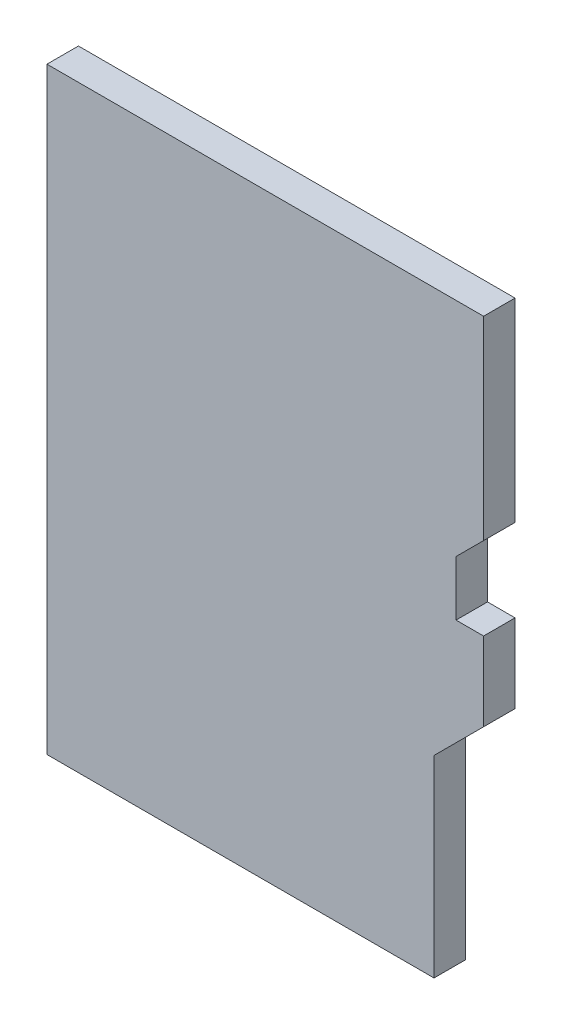
ISO-10303-21;
HEADER;
FILE_DESCRIPTION(('STEP AP214'),'2;1');
FILE_NAME('part.step','',(''),(''),'','','');
FILE_SCHEMA(('AUTOMOTIVE_DESIGN { 1 0 10303 214 1 1 1 1 }'));
ENDSEC;
DATA;
#1=APPLICATION_CONTEXT('core data for automotive mechanical design processes');
#2=APPLICATION_PROTOCOL_DEFINITION('international standard','automotive_design',2000,#1);
#3=PRODUCT_CONTEXT('',#1,'mechanical');
#4=PRODUCT('Part','Part','',(#3));
#5=PRODUCT_RELATED_PRODUCT_CATEGORY('part','',(#4));
#6=PRODUCT_DEFINITION_FORMATION('','',#4);
#7=PRODUCT_DEFINITION_CONTEXT('part definition',#1,'design');
#8=PRODUCT_DEFINITION('design','',#6,#7);
#9=PRODUCT_DEFINITION_SHAPE('','',#8);
#10=(LENGTH_UNIT() NAMED_UNIT(*) SI_UNIT(.MILLI.,.METRE.));
#11=(NAMED_UNIT(*) PLANE_ANGLE_UNIT() SI_UNIT($,.RADIAN.));
#12=(NAMED_UNIT(*) SI_UNIT($,.STERADIAN.) SOLID_ANGLE_UNIT());
#13=UNCERTAINTY_MEASURE_WITH_UNIT(LENGTH_MEASURE(1.E-05),#10,'distance_accuracy_value','');
#14=(GEOMETRIC_REPRESENTATION_CONTEXT(3) GLOBAL_UNCERTAINTY_ASSIGNED_CONTEXT((#13)) GLOBAL_UNIT_ASSIGNED_CONTEXT((#10,
#11,#12)) REPRESENTATION_CONTEXT('',''));
#15=CARTESIAN_POINT('',(0.,0.,0.));
#16=DIRECTION('',(0.,0.,1.));
#17=DIRECTION('',(1.,0.,0.));
#18=AXIS2_PLACEMENT_3D('',#15,#16,#17);
#19=CARTESIAN_POINT('',(4.85,0.,0.8));
#20=DIRECTION('',(-1.,0.,0.));
#21=DIRECTION('',(0.,0.,1.));
#22=AXIS2_PLACEMENT_3D('',#19,#20,#21);
#23=PLANE('',#22);
#24=DIRECTION('',(0.,1.,0.));
#25=VECTOR('',#24,1.);
#26=CARTESIAN_POINT('',(4.85,0.,0.));
#27=LINE('',#26,#25);
#28=CARTESIAN_POINT('',(4.85,0.560000000000007,0.));
#29=VERTEX_POINT('',#28);
#30=CARTESIAN_POINT('',(4.85,1.96000000000001,0.));
#31=VERTEX_POINT('',#30);
#32=EDGE_CURVE('E212',#29,#31,#27,.T.);
#33=ORIENTED_EDGE('',*,*,#32,.T.);
#34=DIRECTION('',(0.,0.,-1.));
#35=VECTOR('',#34,1.);
#36=CARTESIAN_POINT('',(4.85,1.96000000000001,0.8));
#37=LINE('',#36,#35);
#38=CARTESIAN_POINT('',(4.85,1.96000000000001,0.8));
#39=VERTEX_POINT('',#38);
#40=EDGE_CURVE('E11',#39,#31,#37,.T.);
#41=ORIENTED_EDGE('',*,*,#40,.F.);
#42=DIRECTION('',(0.,1.,0.));
#43=VECTOR('',#42,1.);
#44=CARTESIAN_POINT('',(4.85,0.,0.8));
#45=LINE('',#44,#43);
#46=CARTESIAN_POINT('',(4.85,0.560000000000007,0.8));
#47=VERTEX_POINT('',#46);
#48=EDGE_CURVE('E163',#47,#39,#45,.T.);
#49=ORIENTED_EDGE('',*,*,#48,.F.);
#50=DIRECTION('',(0.,0.,-1.));
#51=VECTOR('',#50,1.);
#52=CARTESIAN_POINT('',(4.85,0.560000000000007,0.8));
#53=LINE('',#52,#51);
#54=EDGE_CURVE('E152',#47,#29,#53,.T.);
#55=ORIENTED_EDGE('',*,*,#54,.T.);
#56=EDGE_LOOP('',(#33,#41,#49,#55));
#57=FACE_BOUND('',#56,.T.);
#58=ADVANCED_FACE('F41',(#57),#23,.F.);
#59=CARTESIAN_POINT('',(1.44500000000001,-1.445,0.8));
#60=DIRECTION('',(-0.707106781186549,0.707106781186546,0.));
#61=DIRECTION('',(-0.707106781186546,-0.707106781186549,0.));
#62=AXIS2_PLACEMENT_3D('',#59,#60,#61);
#63=PLANE('',#62);
#64=DIRECTION('',(0.707106781186546,0.707106781186549,0.));
#65=VECTOR('',#64,1.);
#66=CARTESIAN_POINT('',(1.44500000000001,-1.445,0.));
#67=LINE('',#66,#65);
#68=CARTESIAN_POINT('',(5.55,2.66000000000001,0.));
#69=VERTEX_POINT('',#68);
#70=EDGE_CURVE('E203',#31,#69,#67,.T.);
#71=ORIENTED_EDGE('',*,*,#70,.T.);
#72=DIRECTION('',(0.,0.,-1.));
#73=VECTOR('',#72,1.);
#74=CARTESIAN_POINT('',(5.55,2.66000000000001,0.8));
#75=LINE('',#74,#73);
#76=CARTESIAN_POINT('',(5.55,2.66000000000001,0.8));
#77=VERTEX_POINT('',#76);
#78=EDGE_CURVE('E50',#77,#69,#75,.T.);
#79=ORIENTED_EDGE('',*,*,#78,.F.);
#80=DIRECTION('',(0.707106781186546,0.707106781186549,0.));
#81=VECTOR('',#80,1.);
#82=CARTESIAN_POINT('',(1.44500000000001,-1.445,0.8));
#83=LINE('',#82,#81);
#84=EDGE_CURVE('E107',#39,#77,#83,.T.);
#85=ORIENTED_EDGE('',*,*,#84,.F.);
#86=ORIENTED_EDGE('',*,*,#40,.T.);
#87=EDGE_LOOP('',(#71,#79,#85,#86));
#88=FACE_BOUND('',#87,.T.);
#89=ADVANCED_FACE('F258',(#88),#63,.F.);
#90=CARTESIAN_POINT('',(5.55,0.,0.8));
#91=DIRECTION('',(-1.,0.,0.));
#92=DIRECTION('',(0.,0.,1.));
#93=AXIS2_PLACEMENT_3D('',#90,#91,#92);
#94=PLANE('',#93);
#95=DIRECTION('',(0.,1.,0.));
#96=VECTOR('',#95,1.);
#97=CARTESIAN_POINT('',(5.55,0.,0.));
#98=LINE('',#97,#96);
#99=CARTESIAN_POINT('',(5.55,7.6,0.));
#100=VERTEX_POINT('',#99);
#101=EDGE_CURVE('E172',#69,#100,#98,.T.);
#102=ORIENTED_EDGE('',*,*,#101,.T.);
#103=DIRECTION('',(0.,0.,-1.));
#104=VECTOR('',#103,1.);
#105=CARTESIAN_POINT('',(5.55,7.6,0.8));
#106=LINE('',#105,#104);
#107=CARTESIAN_POINT('',(5.55,7.6,0.8));
#108=VERTEX_POINT('',#107);
#109=EDGE_CURVE('E191',#108,#100,#106,.T.);
#110=ORIENTED_EDGE('',*,*,#109,.F.);
#111=DIRECTION('',(0.,1.,0.));
#112=VECTOR('',#111,1.);
#113=CARTESIAN_POINT('',(5.55,0.,0.8));
#114=LINE('',#113,#112);
#115=EDGE_CURVE('E150',#77,#108,#114,.T.);
#116=ORIENTED_EDGE('',*,*,#115,.F.);
#117=ORIENTED_EDGE('',*,*,#78,.T.);
#118=EDGE_LOOP('',(#102,#110,#116,#117));
#119=FACE_BOUND('',#118,.T.);
#120=ADVANCED_FACE('F198',(#119),#94,.F.);
#121=CARTESIAN_POINT('',(0.,7.6,0.8));
#122=DIRECTION('',(0.,-1.,0.));
#123=DIRECTION('',(1.,0.,0.));
#124=AXIS2_PLACEMENT_3D('',#121,#122,#123);
#125=PLANE('',#124);
#126=DIRECTION('',(-1.,0.,0.));
#127=VECTOR('',#126,1.);
#128=CARTESIAN_POINT('',(0.,7.6,0.));
#129=LINE('',#128,#127);
#130=CARTESIAN_POINT('',(-5.55,7.6,0.));
#131=VERTEX_POINT('',#130);
#132=EDGE_CURVE('E206',#100,#131,#129,.T.);
#133=ORIENTED_EDGE('',*,*,#132,.T.);
#134=DIRECTION('',(0.,0.,-1.));
#135=VECTOR('',#134,1.);
#136=CARTESIAN_POINT('',(-5.55,7.6,0.8));
#137=LINE('',#136,#135);
#138=CARTESIAN_POINT('',(-5.55,7.6,0.8));
#139=VERTEX_POINT('',#138);
#140=EDGE_CURVE('E188',#139,#131,#137,.T.);
#141=ORIENTED_EDGE('',*,*,#140,.F.);
#142=DIRECTION('',(-1.,0.,0.));
#143=VECTOR('',#142,1.);
#144=CARTESIAN_POINT('',(0.,7.6,0.8));
#145=LINE('',#144,#143);
#146=EDGE_CURVE('E157',#108,#139,#145,.T.);
#147=ORIENTED_EDGE('',*,*,#146,.F.);
#148=ORIENTED_EDGE('',*,*,#109,.T.);
#149=EDGE_LOOP('',(#133,#141,#147,#148));
#150=FACE_BOUND('',#149,.T.);
#151=ADVANCED_FACE('F255',(#150),#125,.F.);
#152=CARTESIAN_POINT('',(-5.55,0.,0.8));
#153=DIRECTION('',(-1.,0.,0.));
#154=DIRECTION('',(0.,0.,1.));
#155=AXIS2_PLACEMENT_3D('',#152,#153,#154);
#156=PLANE('',#155);
#157=DIRECTION('',(0.,1.,0.));
#158=VECTOR('',#157,1.);
#159=CARTESIAN_POINT('',(-5.55,0.,0.));
#160=LINE('',#159,#158);
#161=CARTESIAN_POINT('',(-5.55,-7.6,0.));
#162=VERTEX_POINT('',#161);
#163=EDGE_CURVE('E210',#162,#131,#160,.T.);
#164=ORIENTED_EDGE('',*,*,#163,.F.);
#165=DIRECTION('',(0.,0.,-1.));
#166=VECTOR('',#165,1.);
#167=CARTESIAN_POINT('',(-5.55,-7.6,0.8));
#168=LINE('',#167,#166);
#169=CARTESIAN_POINT('',(-5.55,-7.6,0.8));
#170=VERTEX_POINT('',#169);
#171=EDGE_CURVE('E185',#170,#162,#168,.T.);
#172=ORIENTED_EDGE('',*,*,#171,.F.);
#173=DIRECTION('',(0.,1.,0.));
#174=VECTOR('',#173,1.);
#175=CARTESIAN_POINT('',(-5.55,0.,0.8));
#176=LINE('',#175,#174);
#177=EDGE_CURVE('E162',#170,#139,#176,.T.);
#178=ORIENTED_EDGE('',*,*,#177,.T.);
#179=ORIENTED_EDGE('',*,*,#140,.T.);
#180=EDGE_LOOP('',(#164,#172,#178,#179));
#181=FACE_BOUND('',#180,.T.);
#182=ADVANCED_FACE('F243',(#181),#156,.T.);
#183=CARTESIAN_POINT('',(0.,-7.6,0.8));
#184=DIRECTION('',(0.,-1.,0.));
#185=DIRECTION('',(1.,0.,0.));
#186=AXIS2_PLACEMENT_3D('',#183,#184,#185);
#187=PLANE('',#186);
#188=DIRECTION('',(-1.,0.,0.));
#189=VECTOR('',#188,1.);
#190=CARTESIAN_POINT('',(0.,-7.6,0.));
#191=LINE('',#190,#189);
#192=CARTESIAN_POINT('',(4.29,-7.6,0.));
#193=VERTEX_POINT('',#192);
#194=EDGE_CURVE('E218',#193,#162,#191,.T.);
#195=ORIENTED_EDGE('',*,*,#194,.F.);
#196=DIRECTION('',(0.,0.,-1.));
#197=VECTOR('',#196,1.);
#198=CARTESIAN_POINT('',(4.29,-7.6,0.8));
#199=LINE('',#198,#197);
#200=CARTESIAN_POINT('',(4.29,-7.6,0.8));
#201=VERTEX_POINT('',#200);
#202=EDGE_CURVE('E182',#201,#193,#199,.T.);
#203=ORIENTED_EDGE('',*,*,#202,.F.);
#204=DIRECTION('',(-1.,0.,0.));
#205=VECTOR('',#204,1.);
#206=CARTESIAN_POINT('',(0.,-7.6,0.8));
#207=LINE('',#206,#205);
#208=EDGE_CURVE('E234',#201,#170,#207,.T.);
#209=ORIENTED_EDGE('',*,*,#208,.T.);
#210=ORIENTED_EDGE('',*,*,#171,.T.);
#211=EDGE_LOOP('',(#195,#203,#209,#210));
#212=FACE_BOUND('',#211,.T.);
#213=ADVANCED_FACE('F247',(#212),#187,.T.);
#214=CARTESIAN_POINT('',(4.29,0.,0.8));
#215=DIRECTION('',(-1.,0.,0.));
#216=DIRECTION('',(0.,0.,1.));
#217=AXIS2_PLACEMENT_3D('',#214,#215,#216);
#218=PLANE('',#217);
#219=DIRECTION('',(0.,1.,0.));
#220=VECTOR('',#219,1.);
#221=CARTESIAN_POINT('',(4.29,0.,0.));
#222=LINE('',#221,#220);
#223=CARTESIAN_POINT('',(4.29,-2.7,0.));
#224=VERTEX_POINT('',#223);
#225=EDGE_CURVE('E221',#193,#224,#222,.T.);
#226=ORIENTED_EDGE('',*,*,#225,.T.);
#227=DIRECTION('',(0.,0.,-1.));
#228=VECTOR('',#227,1.);
#229=CARTESIAN_POINT('',(4.29,-2.7,0.8));
#230=LINE('',#229,#228);
#231=CARTESIAN_POINT('',(4.29,-2.7,0.8));
#232=VERTEX_POINT('',#231);
#233=EDGE_CURVE('E144',#232,#224,#230,.T.);
#234=ORIENTED_EDGE('',*,*,#233,.F.);
#235=DIRECTION('',(0.,1.,0.));
#236=VECTOR('',#235,1.);
#237=CARTESIAN_POINT('',(4.29,0.,0.8));
#238=LINE('',#237,#236);
#239=EDGE_CURVE('E133',#201,#232,#238,.T.);
#240=ORIENTED_EDGE('',*,*,#239,.F.);
#241=ORIENTED_EDGE('',*,*,#202,.T.);
#242=EDGE_LOOP('',(#226,#234,#240,#241));
#243=FACE_BOUND('',#242,.T.);
#244=ADVANCED_FACE('F226',(#243),#218,.F.);
#245=CARTESIAN_POINT('',(3.49500000000001,-3.49499999999999,0.8));
#246=DIRECTION('',(-0.707106781186549,0.707106781186546,0.));
#247=DIRECTION('',(-0.707106781186546,-0.707106781186549,0.));
#248=AXIS2_PLACEMENT_3D('',#245,#246,#247);
#249=PLANE('',#248);
#250=DIRECTION('',(0.707106781186546,0.707106781186549,0.));
#251=VECTOR('',#250,1.);
#252=CARTESIAN_POINT('',(3.49500000000001,-3.49499999999999,0.));
#253=LINE('',#252,#251);
#254=CARTESIAN_POINT('',(5.55,-1.43999999999999,0.));
#255=VERTEX_POINT('',#254);
#256=EDGE_CURVE('E142',#224,#255,#253,.T.);
#257=ORIENTED_EDGE('',*,*,#256,.T.);
#258=DIRECTION('',(0.,0.,-1.));
#259=VECTOR('',#258,1.);
#260=CARTESIAN_POINT('',(5.55,-1.43999999999999,0.8));
#261=LINE('',#260,#259);
#262=CARTESIAN_POINT('',(5.55,-1.43999999999999,0.8));
#263=VERTEX_POINT('',#262);
#264=EDGE_CURVE('E139',#263,#255,#261,.T.);
#265=ORIENTED_EDGE('',*,*,#264,.F.);
#266=DIRECTION('',(0.707106781186546,0.707106781186549,0.));
#267=VECTOR('',#266,1.);
#268=CARTESIAN_POINT('',(3.49500000000001,-3.49499999999999,0.8));
#269=LINE('',#268,#267);
#270=EDGE_CURVE('E126',#232,#263,#269,.T.);
#271=ORIENTED_EDGE('',*,*,#270,.F.);
#272=ORIENTED_EDGE('',*,*,#233,.T.);
#273=EDGE_LOOP('',(#257,#265,#271,#272));
#274=FACE_BOUND('',#273,.T.);
#275=ADVANCED_FACE('F140',(#274),#249,.F.);
#276=CARTESIAN_POINT('',(5.55,0.560000000000008,0.));
#277=VERTEX_POINT('',#276);
#278=EDGE_CURVE('E93',#255,#277,#98,.T.);
#279=ORIENTED_EDGE('',*,*,#278,.T.);
#280=DIRECTION('',(0.,0.,-1.));
#281=VECTOR('',#280,1.);
#282=CARTESIAN_POINT('',(5.55,0.560000000000008,0.8));
#283=LINE('',#282,#281);
#284=CARTESIAN_POINT('',(5.55,0.560000000000008,0.8));
#285=VERTEX_POINT('',#284);
#286=EDGE_CURVE('E145',#285,#277,#283,.T.);
#287=ORIENTED_EDGE('',*,*,#286,.F.);
#288=EDGE_CURVE('E130',#263,#285,#114,.T.);
#289=ORIENTED_EDGE('',*,*,#288,.F.);
#290=ORIENTED_EDGE('',*,*,#264,.T.);
#291=EDGE_LOOP('',(#279,#287,#289,#290));
#292=FACE_BOUND('',#291,.T.);
#293=ADVANCED_FACE('F147',(#292),#94,.F.);
#294=CARTESIAN_POINT('',(0.,0.560000000000006,0.8));
#295=DIRECTION('',(0.,-1.,0.));
#296=DIRECTION('',(1.,0.,0.));
#297=AXIS2_PLACEMENT_3D('',#294,#295,#296);
#298=PLANE('',#297);
#299=DIRECTION('',(-1.,0.,0.));
#300=VECTOR('',#299,1.);
#301=CARTESIAN_POINT('',(0.,0.560000000000006,0.));
#302=LINE('',#301,#300);
#303=EDGE_CURVE('E99',#277,#29,#302,.T.);
#304=ORIENTED_EDGE('',*,*,#303,.T.);
#305=ORIENTED_EDGE('',*,*,#54,.F.);
#306=DIRECTION('',(-1.,0.,0.));
#307=VECTOR('',#306,1.);
#308=CARTESIAN_POINT('',(0.,0.560000000000006,0.8));
#309=LINE('',#308,#307);
#310=EDGE_CURVE('E58',#285,#47,#309,.T.);
#311=ORIENTED_EDGE('',*,*,#310,.F.);
#312=ORIENTED_EDGE('',*,*,#286,.T.);
#313=EDGE_LOOP('',(#304,#305,#311,#312));
#314=FACE_BOUND('',#313,.T.);
#315=ADVANCED_FACE('F306',(#314),#298,.F.);
#316=CARTESIAN_POINT('',(0.,0.,0.8));
#317=DIRECTION('',(0.,0.,1.));
#318=DIRECTION('',(1.,0.,0.));
#319=AXIS2_PLACEMENT_3D('',#316,#317,#318);
#320=PLANE('',#319);
#321=ORIENTED_EDGE('',*,*,#48,.T.);
#322=ORIENTED_EDGE('',*,*,#84,.T.);
#323=ORIENTED_EDGE('',*,*,#115,.T.);
#324=ORIENTED_EDGE('',*,*,#146,.T.);
#325=ORIENTED_EDGE('',*,*,#177,.F.);
#326=ORIENTED_EDGE('',*,*,#208,.F.);
#327=ORIENTED_EDGE('',*,*,#239,.T.);
#328=ORIENTED_EDGE('',*,*,#270,.T.);
#329=ORIENTED_EDGE('',*,*,#288,.T.);
#330=ORIENTED_EDGE('',*,*,#310,.T.);
#331=EDGE_LOOP('',(#321,#322,#323,#324,#325,#326,#327,#328,#329,#330));
#332=FACE_BOUND('',#331,.T.);
#333=ADVANCED_FACE('F128',(#332),#320,.T.);
#334=CARTESIAN_POINT('',(0.,0.,0.));
#335=DIRECTION('',(0.,0.,1.));
#336=DIRECTION('',(1.,0.,0.));
#337=AXIS2_PLACEMENT_3D('',#334,#335,#336);
#338=PLANE('',#337);
#339=ORIENTED_EDGE('',*,*,#32,.F.);
#340=ORIENTED_EDGE('',*,*,#303,.F.);
#341=ORIENTED_EDGE('',*,*,#278,.F.);
#342=ORIENTED_EDGE('',*,*,#256,.F.);
#343=ORIENTED_EDGE('',*,*,#225,.F.);
#344=ORIENTED_EDGE('',*,*,#194,.T.);
#345=ORIENTED_EDGE('',*,*,#163,.T.);
#346=ORIENTED_EDGE('',*,*,#132,.F.);
#347=ORIENTED_EDGE('',*,*,#101,.F.);
#348=ORIENTED_EDGE('',*,*,#70,.F.);
#349=EDGE_LOOP('',(#339,#340,#341,#342,#343,#344,#345,#346,#347,#348));
#350=FACE_BOUND('',#349,.T.);
#351=ADVANCED_FACE('F202',(#350),#338,.F.);
#352=CLOSED_SHELL('',(#58,#89,#120,#151,#182,#213,#244,#275,#293,#315,#333,#351));
#353=MANIFOLD_SOLID_BREP('B2',#352);
#354=ADVANCED_BREP_SHAPE_REPRESENTATION('',(#18,#353),#14);
#355=SHAPE_DEFINITION_REPRESENTATION(#9,#354);
ENDSEC;
END-ISO-10303-21;
